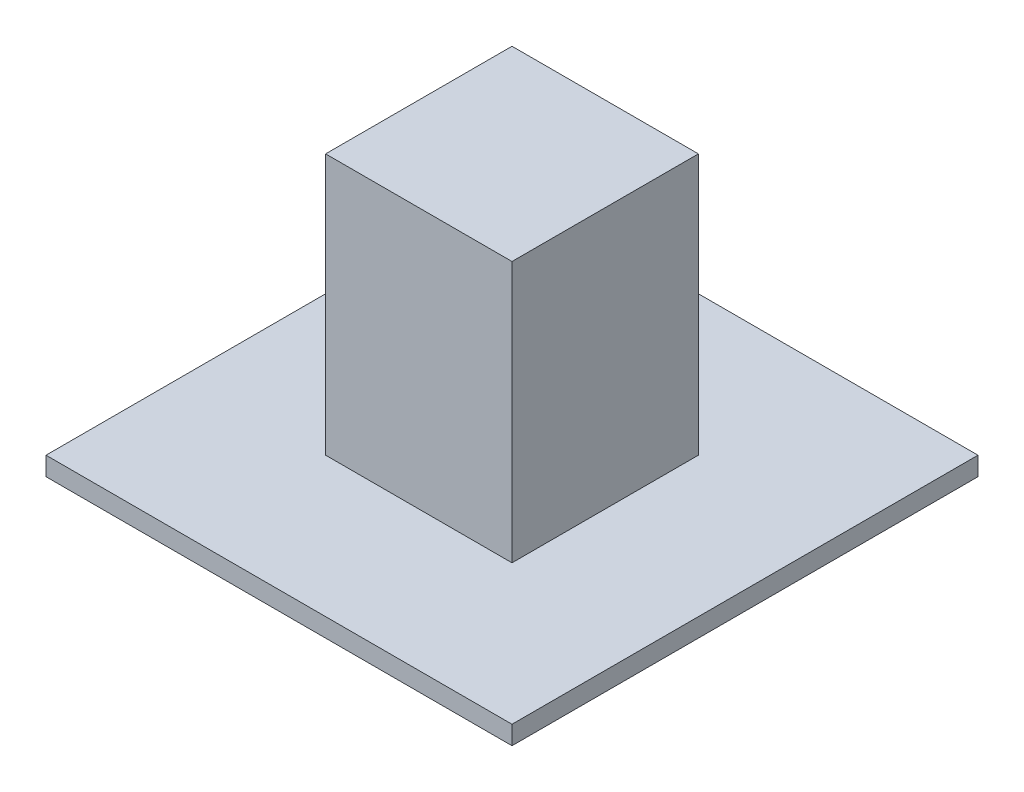
ISO-10303-21;
HEADER;
FILE_DESCRIPTION(('STEP AP214'),'2;1');
FILE_NAME('part.step','',(''),(''),'','','');
FILE_SCHEMA(('AUTOMOTIVE_DESIGN { 1 0 10303 214 1 1 1 1 }'));
ENDSEC;
DATA;
#1=APPLICATION_CONTEXT('core data for automotive mechanical design processes');
#2=APPLICATION_PROTOCOL_DEFINITION('international standard','automotive_design',2000,#1);
#3=PRODUCT_CONTEXT('',#1,'mechanical');
#4=PRODUCT('Part','Part','',(#3));
#5=PRODUCT_RELATED_PRODUCT_CATEGORY('part','',(#4));
#6=PRODUCT_DEFINITION_FORMATION('','',#4);
#7=PRODUCT_DEFINITION_CONTEXT('part definition',#1,'design');
#8=PRODUCT_DEFINITION('design','',#6,#7);
#9=PRODUCT_DEFINITION_SHAPE('','',#8);
#10=(LENGTH_UNIT() NAMED_UNIT(*) SI_UNIT(.MILLI.,.METRE.));
#11=(NAMED_UNIT(*) PLANE_ANGLE_UNIT() SI_UNIT($,.RADIAN.));
#12=(NAMED_UNIT(*) SI_UNIT($,.STERADIAN.) SOLID_ANGLE_UNIT());
#13=UNCERTAINTY_MEASURE_WITH_UNIT(LENGTH_MEASURE(1.E-05),#10,'distance_accuracy_value','');
#14=(GEOMETRIC_REPRESENTATION_CONTEXT(3) GLOBAL_UNCERTAINTY_ASSIGNED_CONTEXT((#13)) GLOBAL_UNIT_ASSIGNED_CONTEXT((#10,
#11,#12)) REPRESENTATION_CONTEXT('',''));
#15=CARTESIAN_POINT('',(0.,0.,0.));
#16=DIRECTION('',(0.,0.,1.));
#17=DIRECTION('',(1.,0.,0.));
#18=AXIS2_PLACEMENT_3D('',#15,#16,#17);
#19=CARTESIAN_POINT('',(5.99999999999999,12.4932945742923,6.00000000000001));
#20=DIRECTION('',(-1.,0.,0.));
#21=DIRECTION('',(0.,0.,1.));
#22=AXIS2_PLACEMENT_3D('',#19,#20,#21);
#23=PLANE('',#22);
#24=DIRECTION('',(0.,0.,-1.));
#25=VECTOR('',#24,1.);
#26=CARTESIAN_POINT('',(5.99999999999999,-4.30670542570767,6.00000000000001));
#27=LINE('',#26,#25);
#28=CARTESIAN_POINT('',(5.99999999999999,-4.30670542570767,6.00000000000001));
#29=VERTEX_POINT('',#28);
#30=CARTESIAN_POINT('',(5.99999999999999,-4.30670542570767,-6.));
#31=VERTEX_POINT('',#30);
#32=EDGE_CURVE('E153',#29,#31,#27,.T.);
#33=ORIENTED_EDGE('',*,*,#32,.T.);
#34=DIRECTION('',(0.,-1.,0.));
#35=VECTOR('',#34,1.);
#36=CARTESIAN_POINT('',(5.99999999999999,12.4932945742923,-6.));
#37=LINE('',#36,#35);
#38=CARTESIAN_POINT('',(5.99999999999999,12.4932945742923,-6.));
#39=VERTEX_POINT('',#38);
#40=EDGE_CURVE('E11',#39,#31,#37,.T.);
#41=ORIENTED_EDGE('',*,*,#40,.F.);
#42=DIRECTION('',(0.,0.,-1.));
#43=VECTOR('',#42,1.);
#44=CARTESIAN_POINT('',(5.99999999999999,12.4932945742923,6.00000000000001));
#45=LINE('',#44,#43);
#46=CARTESIAN_POINT('',(5.99999999999999,12.4932945742923,6.00000000000001));
#47=VERTEX_POINT('',#46);
#48=EDGE_CURVE('E159',#47,#39,#45,.T.);
#49=ORIENTED_EDGE('',*,*,#48,.F.);
#50=DIRECTION('',(0.,-1.,0.));
#51=VECTOR('',#50,1.);
#52=CARTESIAN_POINT('',(5.99999999999999,12.4932945742923,6.00000000000001));
#53=LINE('',#52,#51);
#54=EDGE_CURVE('E171',#47,#29,#53,.T.);
#55=ORIENTED_EDGE('',*,*,#54,.T.);
#56=EDGE_LOOP('',(#33,#41,#49,#55));
#57=FACE_BOUND('',#56,.T.);
#58=ADVANCED_FACE('F39',(#57),#23,.F.);
#59=CARTESIAN_POINT('',(-6.00000000000001,12.4932945742923,-6.));
#60=DIRECTION('',(0.,0.,1.));
#61=DIRECTION('',(1.,0.,0.));
#62=AXIS2_PLACEMENT_3D('',#59,#60,#61);
#63=PLANE('',#62);
#64=DIRECTION('',(-1.,0.,0.));
#65=VECTOR('',#64,1.);
#66=CARTESIAN_POINT('',(-6.00000000000001,-4.30670542570767,-6.));
#67=LINE('',#66,#65);
#68=CARTESIAN_POINT('',(-6.00000000000001,-4.30670542570767,-6.));
#69=VERTEX_POINT('',#68);
#70=EDGE_CURVE('E175',#31,#69,#67,.T.);
#71=ORIENTED_EDGE('',*,*,#70,.T.);
#72=DIRECTION('',(0.,-1.,0.));
#73=VECTOR('',#72,1.);
#74=CARTESIAN_POINT('',(-6.00000000000001,12.4932945742923,-6.));
#75=LINE('',#74,#73);
#76=CARTESIAN_POINT('',(-6.00000000000001,12.4932945742923,-6.));
#77=VERTEX_POINT('',#76);
#78=EDGE_CURVE('E48',#77,#69,#75,.T.);
#79=ORIENTED_EDGE('',*,*,#78,.F.);
#80=DIRECTION('',(-1.,0.,0.));
#81=VECTOR('',#80,1.);
#82=CARTESIAN_POINT('',(-6.00000000000001,12.4932945742923,-6.));
#83=LINE('',#82,#81);
#84=EDGE_CURVE('E162',#39,#77,#83,.T.);
#85=ORIENTED_EDGE('',*,*,#84,.F.);
#86=ORIENTED_EDGE('',*,*,#40,.T.);
#87=EDGE_LOOP('',(#71,#79,#85,#86));
#88=FACE_BOUND('',#87,.T.);
#89=ADVANCED_FACE('F201',(#88),#63,.F.);
#90=CARTESIAN_POINT('',(-6.00000000000001,12.4932945742923,6.00000000000001));
#91=DIRECTION('',(1.,0.,0.));
#92=DIRECTION('',(0.,0.,-1.));
#93=AXIS2_PLACEMENT_3D('',#90,#91,#92);
#94=PLANE('',#93);
#95=DIRECTION('',(0.,0.,1.));
#96=VECTOR('',#95,1.);
#97=CARTESIAN_POINT('',(-6.00000000000001,-4.30670542570767,6.00000000000001));
#98=LINE('',#97,#96);
#99=CARTESIAN_POINT('',(-6.00000000000001,-4.30670542570767,6.00000000000001));
#100=VERTEX_POINT('',#99);
#101=EDGE_CURVE('E179',#69,#100,#98,.T.);
#102=ORIENTED_EDGE('',*,*,#101,.T.);
#103=DIRECTION('',(0.,-1.,0.));
#104=VECTOR('',#103,1.);
#105=CARTESIAN_POINT('',(-6.00000000000001,12.4932945742923,6.00000000000001));
#106=LINE('',#105,#104);
#107=CARTESIAN_POINT('',(-6.00000000000001,12.4932945742923,6.00000000000001));
#108=VERTEX_POINT('',#107);
#109=EDGE_CURVE('E189',#108,#100,#106,.T.);
#110=ORIENTED_EDGE('',*,*,#109,.F.);
#111=DIRECTION('',(0.,0.,1.));
#112=VECTOR('',#111,1.);
#113=CARTESIAN_POINT('',(-6.00000000000001,12.4932945742923,6.00000000000001));
#114=LINE('',#113,#112);
#115=EDGE_CURVE('E166',#77,#108,#114,.T.);
#116=ORIENTED_EDGE('',*,*,#115,.F.);
#117=ORIENTED_EDGE('',*,*,#78,.T.);
#118=EDGE_LOOP('',(#102,#110,#116,#117));
#119=FACE_BOUND('',#118,.T.);
#120=ADVANCED_FACE('F197',(#119),#94,.F.);
#121=CARTESIAN_POINT('',(-6.00000000000001,12.4932945742923,6.00000000000001));
#122=DIRECTION('',(0.,0.,-1.));
#123=DIRECTION('',(-1.,0.,0.));
#124=AXIS2_PLACEMENT_3D('',#121,#122,#123);
#125=PLANE('',#124);
#126=DIRECTION('',(1.,0.,0.));
#127=VECTOR('',#126,1.);
#128=CARTESIAN_POINT('',(-6.00000000000001,-4.30670542570767,6.00000000000001));
#129=LINE('',#128,#127);
#130=EDGE_CURVE('E163',#100,#29,#129,.T.);
#131=ORIENTED_EDGE('',*,*,#130,.T.);
#132=ORIENTED_EDGE('',*,*,#54,.F.);
#133=DIRECTION('',(1.,0.,0.));
#134=VECTOR('',#133,1.);
#135=CARTESIAN_POINT('',(-6.00000000000001,12.4932945742923,6.00000000000001));
#136=LINE('',#135,#134);
#137=EDGE_CURVE('E55',#108,#47,#136,.T.);
#138=ORIENTED_EDGE('',*,*,#137,.F.);
#139=ORIENTED_EDGE('',*,*,#109,.T.);
#140=EDGE_LOOP('',(#131,#132,#138,#139));
#141=FACE_BOUND('',#140,.T.);
#142=ADVANCED_FACE('F207',(#141),#125,.F.);
#143=CARTESIAN_POINT('',(0.,12.4932945742923,0.));
#144=DIRECTION('',(0.,-1.,0.));
#145=DIRECTION('',(0.,0.,-1.));
#146=AXIS2_PLACEMENT_3D('',#143,#144,#145);
#147=PLANE('',#146);
#148=ORIENTED_EDGE('',*,*,#48,.T.);
#149=ORIENTED_EDGE('',*,*,#84,.T.);
#150=ORIENTED_EDGE('',*,*,#115,.T.);
#151=ORIENTED_EDGE('',*,*,#137,.T.);
#152=EDGE_LOOP('',(#148,#149,#150,#151));
#153=FACE_BOUND('',#152,.T.);
#154=ADVANCED_FACE('F210',(#153),#147,.F.);
#155=CARTESIAN_POINT('',(15.,-5.50670542570767,15.));
#156=DIRECTION('',(1.,0.,0.));
#157=DIRECTION('',(0.,0.,-1.));
#158=AXIS2_PLACEMENT_3D('',#155,#156,#157);
#159=PLANE('',#158);
#160=DIRECTION('',(0.,0.,-1.));
#161=VECTOR('',#160,1.);
#162=CARTESIAN_POINT('',(15.,-4.30670542570767,15.));
#163=LINE('',#162,#161);
#164=CARTESIAN_POINT('',(15.,-4.30670542570767,15.));
#165=VERTEX_POINT('',#164);
#166=CARTESIAN_POINT('',(15.,-4.30670542570767,-15.));
#167=VERTEX_POINT('',#166);
#168=EDGE_CURVE('E142',#165,#167,#163,.T.);
#169=ORIENTED_EDGE('',*,*,#168,.F.);
#170=DIRECTION('',(0.,1.,0.));
#171=VECTOR('',#170,1.);
#172=CARTESIAN_POINT('',(15.,-5.50670542570767,15.));
#173=LINE('',#172,#171);
#174=CARTESIAN_POINT('',(15.,-5.50670542570767,15.));
#175=VERTEX_POINT('',#174);
#176=EDGE_CURVE('E126',#175,#165,#173,.T.);
#177=ORIENTED_EDGE('',*,*,#176,.F.);
#178=DIRECTION('',(0.,0.,-1.));
#179=VECTOR('',#178,1.);
#180=CARTESIAN_POINT('',(15.,-5.50670542570767,15.));
#181=LINE('',#180,#179);
#182=CARTESIAN_POINT('',(15.,-5.50670542570767,-15.));
#183=VERTEX_POINT('',#182);
#184=EDGE_CURVE('E119',#175,#183,#181,.T.);
#185=ORIENTED_EDGE('',*,*,#184,.T.);
#186=DIRECTION('',(0.,1.,0.));
#187=VECTOR('',#186,1.);
#188=CARTESIAN_POINT('',(15.,-5.50670542570767,-15.));
#189=LINE('',#188,#187);
#190=EDGE_CURVE('E100',#183,#167,#189,.T.);
#191=ORIENTED_EDGE('',*,*,#190,.T.);
#192=EDGE_LOOP('',(#169,#177,#185,#191));
#193=FACE_BOUND('',#192,.T.);
#194=ADVANCED_FACE('F125',(#193),#159,.T.);
#195=CARTESIAN_POINT('',(-15.,-5.50670542570767,15.));
#196=DIRECTION('',(0.,0.,1.));
#197=DIRECTION('',(1.,0.,0.));
#198=AXIS2_PLACEMENT_3D('',#195,#196,#197);
#199=PLANE('',#198);
#200=DIRECTION('',(1.,0.,0.));
#201=VECTOR('',#200,1.);
#202=CARTESIAN_POINT('',(-15.,-4.30670542570767,15.));
#203=LINE('',#202,#201);
#204=CARTESIAN_POINT('',(-15.,-4.30670542570767,15.));
#205=VERTEX_POINT('',#204);
#206=EDGE_CURVE('E128',#205,#165,#203,.T.);
#207=ORIENTED_EDGE('',*,*,#206,.F.);
#208=DIRECTION('',(0.,1.,0.));
#209=VECTOR('',#208,1.);
#210=CARTESIAN_POINT('',(-15.,-5.50670542570767,15.));
#211=LINE('',#210,#209);
#212=CARTESIAN_POINT('',(-15.,-5.50670542570767,15.));
#213=VERTEX_POINT('',#212);
#214=EDGE_CURVE('E154',#213,#205,#211,.T.);
#215=ORIENTED_EDGE('',*,*,#214,.F.);
#216=DIRECTION('',(1.,0.,0.));
#217=VECTOR('',#216,1.);
#218=CARTESIAN_POINT('',(-15.,-5.50670542570767,15.));
#219=LINE('',#218,#217);
#220=EDGE_CURVE('E112',#213,#175,#219,.T.);
#221=ORIENTED_EDGE('',*,*,#220,.T.);
#222=ORIENTED_EDGE('',*,*,#176,.T.);
#223=EDGE_LOOP('',(#207,#215,#221,#222));
#224=FACE_BOUND('',#223,.T.);
#225=ADVANCED_FACE('F217',(#224),#199,.T.);
#226=CARTESIAN_POINT('',(-15.,-5.50670542570767,15.));
#227=DIRECTION('',(-1.,0.,0.));
#228=DIRECTION('',(0.,0.,1.));
#229=AXIS2_PLACEMENT_3D('',#226,#227,#228);
#230=PLANE('',#229);
#231=DIRECTION('',(0.,0.,1.));
#232=VECTOR('',#231,1.);
#233=CARTESIAN_POINT('',(-15.,-4.30670542570767,15.));
#234=LINE('',#233,#232);
#235=CARTESIAN_POINT('',(-15.,-4.30670542570767,-15.));
#236=VERTEX_POINT('',#235);
#237=EDGE_CURVE('E132',#236,#205,#234,.T.);
#238=ORIENTED_EDGE('',*,*,#237,.F.);
#239=DIRECTION('',(0.,1.,0.));
#240=VECTOR('',#239,1.);
#241=CARTESIAN_POINT('',(-15.,-5.50670542570767,-15.));
#242=LINE('',#241,#240);
#243=CARTESIAN_POINT('',(-15.,-5.50670542570767,-15.));
#244=VERTEX_POINT('',#243);
#245=EDGE_CURVE('E111',#244,#236,#242,.T.);
#246=ORIENTED_EDGE('',*,*,#245,.F.);
#247=DIRECTION('',(0.,0.,1.));
#248=VECTOR('',#247,1.);
#249=CARTESIAN_POINT('',(-15.,-5.50670542570767,15.));
#250=LINE('',#249,#248);
#251=EDGE_CURVE('E122',#244,#213,#250,.T.);
#252=ORIENTED_EDGE('',*,*,#251,.T.);
#253=ORIENTED_EDGE('',*,*,#214,.T.);
#254=EDGE_LOOP('',(#238,#246,#252,#253));
#255=FACE_BOUND('',#254,.T.);
#256=ADVANCED_FACE('F253',(#255),#230,.T.);
#257=CARTESIAN_POINT('',(-15.,-5.50670542570767,-15.));
#258=DIRECTION('',(0.,0.,-1.));
#259=DIRECTION('',(-1.,0.,0.));
#260=AXIS2_PLACEMENT_3D('',#257,#258,#259);
#261=PLANE('',#260);
#262=DIRECTION('',(-1.,0.,0.));
#263=VECTOR('',#262,1.);
#264=CARTESIAN_POINT('',(-15.,-4.30670542570767,-15.));
#265=LINE('',#264,#263);
#266=EDGE_CURVE('E105',#167,#236,#265,.T.);
#267=ORIENTED_EDGE('',*,*,#266,.F.);
#268=ORIENTED_EDGE('',*,*,#190,.F.);
#269=DIRECTION('',(-1.,0.,0.));
#270=VECTOR('',#269,1.);
#271=CARTESIAN_POINT('',(-15.,-5.50670542570767,-15.));
#272=LINE('',#271,#270);
#273=EDGE_CURVE('E103',#183,#244,#272,.T.);
#274=ORIENTED_EDGE('',*,*,#273,.T.);
#275=ORIENTED_EDGE('',*,*,#245,.T.);
#276=EDGE_LOOP('',(#267,#268,#274,#275));
#277=FACE_BOUND('',#276,.T.);
#278=ADVANCED_FACE('F102',(#277),#261,.T.);
#279=CARTESIAN_POINT('',(0.,-5.50670542570767,0.));
#280=DIRECTION('',(0.,-1.,0.));
#281=DIRECTION('',(0.,0.,-1.));
#282=AXIS2_PLACEMENT_3D('',#279,#280,#281);
#283=PLANE('',#282);
#284=CARTESIAN_POINT('',(0.,-5.50670542570767,0.));
#285=DIRECTION('',(0.,-1.,0.));
#286=DIRECTION('',(0.,0.,-1.));
#287=AXIS2_PLACEMENT_3D('',#284,#285,#286);
#288=CIRCLE('',#287,3.);
#289=CARTESIAN_POINT('',(0.,-5.50670542570767,-3.00000000000001));
#290=VERTEX_POINT('',#289);
#291=EDGE_CURVE('E135',#290,#290,#288,.T.);
#292=ORIENTED_EDGE('',*,*,#291,.F.);
#293=EDGE_LOOP('',(#292));
#294=FACE_BOUND('',#293,.T.);
#295=ORIENTED_EDGE('',*,*,#184,.F.);
#296=ORIENTED_EDGE('',*,*,#220,.F.);
#297=ORIENTED_EDGE('',*,*,#251,.F.);
#298=ORIENTED_EDGE('',*,*,#273,.F.);
#299=EDGE_LOOP('',(#295,#296,#297,#298));
#300=FACE_BOUND('',#299,.T.);
#301=ADVANCED_FACE('F117',(#294,#300),#283,.T.);
#302=CARTESIAN_POINT('',(0.,-4.30670542570767,0.));
#303=DIRECTION('',(0.,-1.,0.));
#304=DIRECTION('',(0.,0.,-1.));
#305=AXIS2_PLACEMENT_3D('',#302,#303,#304);
#306=PLANE('',#305);
#307=ORIENTED_EDGE('',*,*,#32,.F.);
#308=ORIENTED_EDGE('',*,*,#130,.F.);
#309=ORIENTED_EDGE('',*,*,#101,.F.);
#310=ORIENTED_EDGE('',*,*,#70,.F.);
#311=EDGE_LOOP('',(#307,#308,#309,#310));
#312=FACE_BOUND('',#311,.T.);
#313=ORIENTED_EDGE('',*,*,#168,.T.);
#314=ORIENTED_EDGE('',*,*,#266,.T.);
#315=ORIENTED_EDGE('',*,*,#237,.T.);
#316=ORIENTED_EDGE('',*,*,#206,.T.);
#317=EDGE_LOOP('',(#313,#314,#315,#316));
#318=FACE_BOUND('',#317,.T.);
#319=ADVANCED_FACE('F204',(#312,#318),#306,.F.);
#320=CARTESIAN_POINT('',(0.,-11.5067054257077,0.));
#321=DIRECTION('',(0.,1.,0.));
#322=DIRECTION('',(0.,0.,1.));
#323=AXIS2_PLACEMENT_3D('',#320,#321,#322);
#324=CYLINDRICAL_SURFACE('',#323,3.);
#325=CARTESIAN_POINT('',(0.,-11.5067054257077,0.));
#326=DIRECTION('',(0.,-1.,0.));
#327=DIRECTION('',(0.,0.,-1.));
#328=AXIS2_PLACEMENT_3D('',#325,#326,#327);
#329=CIRCLE('',#328,3.);
#330=CARTESIAN_POINT('',(0.,-11.5067054257077,-3.00000000000001));
#331=VERTEX_POINT('',#330);
#332=EDGE_CURVE('E145',#331,#331,#329,.T.);
#333=ORIENTED_EDGE('',*,*,#332,.F.);
#334=EDGE_LOOP('',(#333));
#335=FACE_BOUND('',#334,.T.);
#336=ORIENTED_EDGE('',*,*,#291,.T.);
#337=EDGE_LOOP('',(#336));
#338=FACE_BOUND('',#337,.T.);
#339=ADVANCED_FACE('F289',(#335,#338),#324,.T.);
#340=CARTESIAN_POINT('',(0.,-11.5067054257077,0.));
#341=DIRECTION('',(0.,-1.,0.));
#342=DIRECTION('',(0.,0.,-1.));
#343=AXIS2_PLACEMENT_3D('',#340,#341,#342);
#344=PLANE('',#343);
#345=ORIENTED_EDGE('',*,*,#332,.T.);
#346=EDGE_LOOP('',(#345));
#347=FACE_BOUND('',#346,.T.);
#348=ADVANCED_FACE('F298',(#347),#344,.T.);
#349=CLOSED_SHELL('',(#58,#89,#120,#142,#154,#194,#225,#256,#278,#301,#319,#339,#348));
#350=MANIFOLD_SOLID_BREP('B2',#349);
#351=ADVANCED_BREP_SHAPE_REPRESENTATION('',(#18,#350),#14);
#352=SHAPE_DEFINITION_REPRESENTATION(#9,#351);
ENDSEC;
END-ISO-10303-21;
